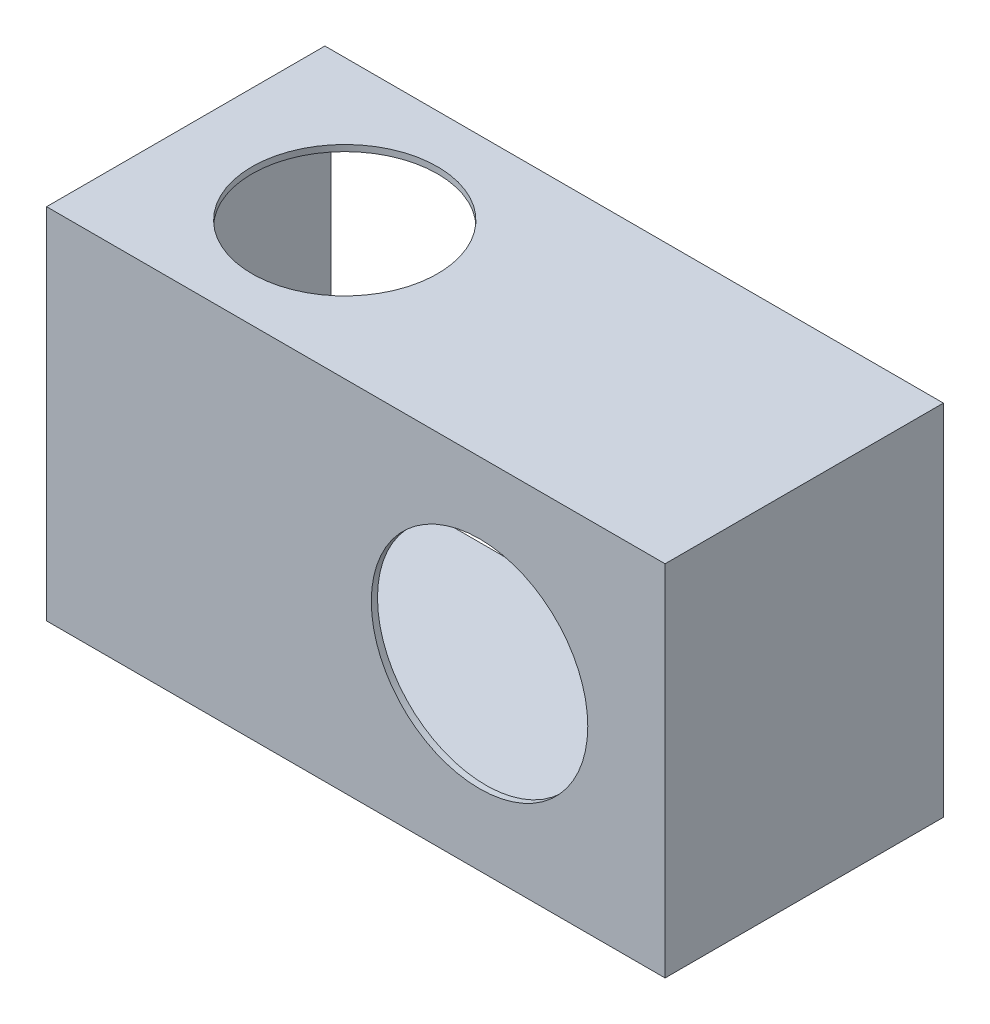
ISO-10303-21;
HEADER;
FILE_DESCRIPTION(('STEP AP214'),'2;1');
FILE_NAME('part.step','',(''),(''),'','','');
FILE_SCHEMA(('AUTOMOTIVE_DESIGN { 1 0 10303 214 1 1 1 1 }'));
ENDSEC;
DATA;
#1=APPLICATION_CONTEXT('core data for automotive mechanical design processes');
#2=APPLICATION_PROTOCOL_DEFINITION('international standard','automotive_design',2000,#1);
#3=PRODUCT_CONTEXT('',#1,'mechanical');
#4=PRODUCT('Part','Part','',(#3));
#5=PRODUCT_RELATED_PRODUCT_CATEGORY('part','',(#4));
#6=PRODUCT_DEFINITION_FORMATION('','',#4);
#7=PRODUCT_DEFINITION_CONTEXT('part definition',#1,'design');
#8=PRODUCT_DEFINITION('design','',#6,#7);
#9=PRODUCT_DEFINITION_SHAPE('','',#8);
#10=(LENGTH_UNIT() NAMED_UNIT(*) SI_UNIT(.MILLI.,.METRE.));
#11=(NAMED_UNIT(*) PLANE_ANGLE_UNIT() SI_UNIT($,.RADIAN.));
#12=(NAMED_UNIT(*) SI_UNIT($,.STERADIAN.) SOLID_ANGLE_UNIT());
#13=UNCERTAINTY_MEASURE_WITH_UNIT(LENGTH_MEASURE(1.E-05),#10,'distance_accuracy_value','');
#14=(GEOMETRIC_REPRESENTATION_CONTEXT(3) GLOBAL_UNCERTAINTY_ASSIGNED_CONTEXT((#13)) GLOBAL_UNIT_ASSIGNED_CONTEXT((#10,
#11,#12)) REPRESENTATION_CONTEXT('',''));
#15=CARTESIAN_POINT('',(0.,0.,0.));
#16=DIRECTION('',(0.,0.,1.));
#17=DIRECTION('',(1.,0.,0.));
#18=AXIS2_PLACEMENT_3D('',#15,#16,#17);
#19=CARTESIAN_POINT('',(-23.2522189572386,-234.055744289987,90.));
#20=DIRECTION('',(-1.,0.,0.));
#21=DIRECTION('',(0.,0.,1.));
#22=AXIS2_PLACEMENT_3D('',#19,#20,#21);
#23=PLANE('',#22);
#24=DIRECTION('',(0.,1.,0.));
#25=VECTOR('',#24,1.);
#26=CARTESIAN_POINT('',(-23.2522189572386,-234.055744289987,0.));
#27=LINE('',#26,#25);
#28=CARTESIAN_POINT('',(-23.2522189572386,-234.055744289987,0.));
#29=VERTEX_POINT('',#28);
#30=CARTESIAN_POINT('',(-23.2522189572386,-118.055744289987,0.));
#31=VERTEX_POINT('',#30);
#32=EDGE_CURVE('E153',#29,#31,#27,.T.);
#33=ORIENTED_EDGE('',*,*,#32,.T.);
#34=DIRECTION('',(0.,0.,-1.));
#35=VECTOR('',#34,1.);
#36=CARTESIAN_POINT('',(-23.2522189572386,-118.055744289987,90.));
#37=LINE('',#36,#35);
#38=CARTESIAN_POINT('',(-23.2522189572386,-118.055744289987,90.));
#39=VERTEX_POINT('',#38);
#40=EDGE_CURVE('E11',#39,#31,#37,.T.);
#41=ORIENTED_EDGE('',*,*,#40,.F.);
#42=DIRECTION('',(0.,1.,0.));
#43=VECTOR('',#42,1.);
#44=CARTESIAN_POINT('',(-23.2522189572386,-234.055744289987,90.));
#45=LINE('',#44,#43);
#46=CARTESIAN_POINT('',(-23.2522189572386,-234.055744289987,90.));
#47=VERTEX_POINT('',#46);
#48=EDGE_CURVE('E144',#47,#39,#45,.T.);
#49=ORIENTED_EDGE('',*,*,#48,.F.);
#50=DIRECTION('',(0.,0.,-1.));
#51=VECTOR('',#50,1.);
#52=CARTESIAN_POINT('',(-23.2522189572386,-234.055744289987,90.));
#53=LINE('',#52,#51);
#54=EDGE_CURVE('E58',#47,#29,#53,.T.);
#55=ORIENTED_EDGE('',*,*,#54,.T.);
#56=EDGE_LOOP('',(#33,#41,#49,#55));
#57=FACE_BOUND('',#56,.T.);
#58=ADVANCED_FACE('F33',(#57),#23,.F.);
#59=CARTESIAN_POINT('',(-23.2522189572386,-118.055744289987,90.));
#60=DIRECTION('',(0.,-1.,0.));
#61=DIRECTION('',(1.,0.,0.));
#62=AXIS2_PLACEMENT_3D('',#59,#60,#61);
#63=PLANE('',#62);
#64=CARTESIAN_POINT('',(-171.255446697937,-118.055744289987,45.5791895315827));
#65=DIRECTION('',(0.,1.,0.));
#66=DIRECTION('',(-1.,0.,0.));
#67=AXIS2_PLACEMENT_3D('',#64,#65,#66);
#68=CIRCLE('',#67,30.);
#69=CARTESIAN_POINT('',(-201.255446697937,-118.055744289987,45.5791895315827));
#70=VERTEX_POINT('',#69);
#71=EDGE_CURVE('E176',#70,#70,#68,.T.);
#72=ORIENTED_EDGE('',*,*,#71,.F.);
#73=EDGE_LOOP('',(#72));
#74=FACE_BOUND('',#73,.T.);
#75=DIRECTION('',(-1.,0.,0.));
#76=VECTOR('',#75,1.);
#77=CARTESIAN_POINT('',(-23.2522189572386,-118.055744289987,0.));
#78=LINE('',#77,#76);
#79=CARTESIAN_POINT('',(-223.252218957239,-118.055744289987,0.));
#80=VERTEX_POINT('',#79);
#81=EDGE_CURVE('E155',#31,#80,#78,.T.);
#82=ORIENTED_EDGE('',*,*,#81,.T.);
#83=DIRECTION('',(0.,0.,-1.));
#84=VECTOR('',#83,1.);
#85=CARTESIAN_POINT('',(-223.252218957239,-118.055744289987,90.));
#86=LINE('',#85,#84);
#87=CARTESIAN_POINT('',(-223.252218957239,-118.055744289987,90.));
#88=VERTEX_POINT('',#87);
#89=EDGE_CURVE('E41',#88,#80,#86,.T.);
#90=ORIENTED_EDGE('',*,*,#89,.F.);
#91=DIRECTION('',(-1.,0.,0.));
#92=VECTOR('',#91,1.);
#93=CARTESIAN_POINT('',(-23.2522189572386,-118.055744289987,90.));
#94=LINE('',#93,#92);
#95=EDGE_CURVE('E84',#39,#88,#94,.T.);
#96=ORIENTED_EDGE('',*,*,#95,.F.);
#97=ORIENTED_EDGE('',*,*,#40,.T.);
#98=EDGE_LOOP('',(#82,#90,#96,#97));
#99=FACE_BOUND('',#98,.T.);
#100=ADVANCED_FACE('F201',(#74,#99),#63,.F.);
#101=CARTESIAN_POINT('',(-223.252218957239,-234.055744289987,90.));
#102=DIRECTION('',(-1.,0.,0.));
#103=DIRECTION('',(0.,0.,1.));
#104=AXIS2_PLACEMENT_3D('',#101,#102,#103);
#105=PLANE('',#104);
#106=DIRECTION('',(0.,1.,0.));
#107=VECTOR('',#106,1.);
#108=CARTESIAN_POINT('',(-223.252218957239,-234.055744289987,0.));
#109=LINE('',#108,#107);
#110=CARTESIAN_POINT('',(-223.252218957239,-234.055744289987,0.));
#111=VERTEX_POINT('',#110);
#112=EDGE_CURVE('E159',#111,#80,#109,.T.);
#113=ORIENTED_EDGE('',*,*,#112,.F.);
#114=DIRECTION('',(0.,0.,-1.));
#115=VECTOR('',#114,1.);
#116=CARTESIAN_POINT('',(-223.252218957239,-234.055744289987,90.));
#117=LINE('',#116,#115);
#118=CARTESIAN_POINT('',(-223.252218957239,-234.055744289987,90.));
#119=VERTEX_POINT('',#118);
#120=EDGE_CURVE('E165',#119,#111,#117,.T.);
#121=ORIENTED_EDGE('',*,*,#120,.F.);
#122=DIRECTION('',(0.,1.,0.));
#123=VECTOR('',#122,1.);
#124=CARTESIAN_POINT('',(-223.252218957239,-234.055744289987,90.));
#125=LINE('',#124,#123);
#126=EDGE_CURVE('E148',#119,#88,#125,.T.);
#127=ORIENTED_EDGE('',*,*,#126,.T.);
#128=ORIENTED_EDGE('',*,*,#89,.T.);
#129=EDGE_LOOP('',(#113,#121,#127,#128));
#130=FACE_BOUND('',#129,.T.);
#131=ADVANCED_FACE('F205',(#130),#105,.T.);
#132=CARTESIAN_POINT('',(-23.2522189572386,-234.055744289987,90.));
#133=DIRECTION('',(0.,-1.,0.));
#134=DIRECTION('',(1.,0.,0.));
#135=AXIS2_PLACEMENT_3D('',#132,#133,#134);
#136=PLANE('',#135);
#137=DIRECTION('',(-1.,0.,0.));
#138=VECTOR('',#137,1.);
#139=CARTESIAN_POINT('',(-23.2522189572386,-234.055744289987,0.));
#140=LINE('',#139,#138);
#141=EDGE_CURVE('E146',#29,#111,#140,.T.);
#142=ORIENTED_EDGE('',*,*,#141,.F.);
#143=ORIENTED_EDGE('',*,*,#54,.F.);
#144=DIRECTION('',(-1.,0.,0.));
#145=VECTOR('',#144,1.);
#146=CARTESIAN_POINT('',(-23.2522189572386,-234.055744289987,90.));
#147=LINE('',#146,#145);
#148=EDGE_CURVE('E151',#47,#119,#147,.T.);
#149=ORIENTED_EDGE('',*,*,#148,.T.);
#150=ORIENTED_EDGE('',*,*,#120,.T.);
#151=EDGE_LOOP('',(#142,#143,#149,#150));
#152=FACE_BOUND('',#151,.T.);
#153=ADVANCED_FACE('F208',(#152),#136,.T.);
#154=CARTESIAN_POINT('',(0.,0.,90.));
#155=DIRECTION('',(0.,0.,1.));
#156=DIRECTION('',(1.,0.,0.));
#157=AXIS2_PLACEMENT_3D('',#154,#155,#156);
#158=PLANE('',#157);
#159=CARTESIAN_POINT('',(-83.2522189572386,-176.055744289987,90.));
#160=DIRECTION('',(0.,0.,1.));
#161=DIRECTION('',(1.,0.,0.));
#162=AXIS2_PLACEMENT_3D('',#159,#160,#161);
#163=CIRCLE('',#162,35.);
#164=CARTESIAN_POINT('',(-48.2522189572385,-176.055744289987,90.));
#165=VERTEX_POINT('',#164);
#166=EDGE_CURVE('E139',#165,#165,#163,.T.);
#167=ORIENTED_EDGE('',*,*,#166,.F.);
#168=EDGE_LOOP('',(#167));
#169=FACE_BOUND('',#168,.T.);
#170=ORIENTED_EDGE('',*,*,#48,.T.);
#171=ORIENTED_EDGE('',*,*,#95,.T.);
#172=ORIENTED_EDGE('',*,*,#126,.F.);
#173=ORIENTED_EDGE('',*,*,#148,.F.);
#174=EDGE_LOOP('',(#170,#171,#172,#173));
#175=FACE_BOUND('',#174,.T.);
#176=ADVANCED_FACE('F214',(#169,#175),#158,.T.);
#177=CARTESIAN_POINT('',(0.,0.,0.));
#178=DIRECTION('',(0.,0.,1.));
#179=DIRECTION('',(1.,0.,0.));
#180=AXIS2_PLACEMENT_3D('',#177,#178,#179);
#181=PLANE('',#180);
#182=DIRECTION('',(-1.,0.,0.));
#183=VECTOR('',#182,1.);
#184=CARTESIAN_POINT('',(-23.2522189572386,-232.055744289987,0.));
#185=LINE('',#184,#183);
#186=CARTESIAN_POINT('',(-25.2522189572386,-232.055744289987,0.));
#187=VERTEX_POINT('',#186);
#188=CARTESIAN_POINT('',(-221.252218957239,-232.055744289987,0.));
#189=VERTEX_POINT('',#188);
#190=EDGE_CURVE('E128',#187,#189,#185,.T.);
#191=ORIENTED_EDGE('',*,*,#190,.F.);
#192=DIRECTION('',(0.,1.,0.));
#193=VECTOR('',#192,1.);
#194=CARTESIAN_POINT('',(-25.2522189572386,-234.055744289987,0.));
#195=LINE('',#194,#193);
#196=CARTESIAN_POINT('',(-25.2522189572386,-120.055744289987,0.));
#197=VERTEX_POINT('',#196);
#198=EDGE_CURVE('E115',#187,#197,#195,.T.);
#199=ORIENTED_EDGE('',*,*,#198,.T.);
#200=DIRECTION('',(-1.,0.,0.));
#201=VECTOR('',#200,1.);
#202=CARTESIAN_POINT('',(-23.2522189572386,-120.055744289987,0.));
#203=LINE('',#202,#201);
#204=CARTESIAN_POINT('',(-221.252218957239,-120.055744289987,0.));
#205=VERTEX_POINT('',#204);
#206=EDGE_CURVE('E138',#197,#205,#203,.T.);
#207=ORIENTED_EDGE('',*,*,#206,.T.);
#208=DIRECTION('',(0.,1.,0.));
#209=VECTOR('',#208,1.);
#210=CARTESIAN_POINT('',(-221.252218957239,-234.055744289987,0.));
#211=LINE('',#210,#209);
#212=EDGE_CURVE('E49',#189,#205,#211,.T.);
#213=ORIENTED_EDGE('',*,*,#212,.F.);
#214=EDGE_LOOP('',(#191,#199,#207,#213));
#215=FACE_BOUND('',#214,.T.);
#216=ORIENTED_EDGE('',*,*,#32,.F.);
#217=ORIENTED_EDGE('',*,*,#141,.T.);
#218=ORIENTED_EDGE('',*,*,#112,.T.);
#219=ORIENTED_EDGE('',*,*,#81,.F.);
#220=EDGE_LOOP('',(#216,#217,#218,#219));
#221=FACE_BOUND('',#220,.T.);
#222=ADVANCED_FACE('F184',(#215,#221),#181,.F.);
#223=CARTESIAN_POINT('',(-25.2522189572386,-234.055744289987,90.));
#224=DIRECTION('',(-1.,0.,0.));
#225=DIRECTION('',(0.,0.,1.));
#226=AXIS2_PLACEMENT_3D('',#223,#224,#225);
#227=PLANE('',#226);
#228=ORIENTED_EDGE('',*,*,#198,.F.);
#229=DIRECTION('',(0.,0.,-1.));
#230=VECTOR('',#229,1.);
#231=CARTESIAN_POINT('',(-25.2522189572386,-232.055744289987,90.));
#232=LINE('',#231,#230);
#233=CARTESIAN_POINT('',(-25.2522189572386,-232.055744289987,88.));
#234=VERTEX_POINT('',#233);
#235=EDGE_CURVE('E108',#234,#187,#232,.T.);
#236=ORIENTED_EDGE('',*,*,#235,.F.);
#237=DIRECTION('',(0.,1.,0.));
#238=VECTOR('',#237,1.);
#239=CARTESIAN_POINT('',(-25.2522189572386,-234.055744289987,88.));
#240=LINE('',#239,#238);
#241=CARTESIAN_POINT('',(-25.2522189572386,-120.055744289987,88.));
#242=VERTEX_POINT('',#241);
#243=EDGE_CURVE('E112',#234,#242,#240,.T.);
#244=ORIENTED_EDGE('',*,*,#243,.T.);
#245=DIRECTION('',(0.,0.,-1.));
#246=VECTOR('',#245,1.);
#247=CARTESIAN_POINT('',(-25.2522189572386,-120.055744289987,90.));
#248=LINE('',#247,#246);
#249=EDGE_CURVE('E156',#242,#197,#248,.T.);
#250=ORIENTED_EDGE('',*,*,#249,.T.);
#251=EDGE_LOOP('',(#228,#236,#244,#250));
#252=FACE_BOUND('',#251,.T.);
#253=ADVANCED_FACE('F110',(#252),#227,.T.);
#254=CARTESIAN_POINT('',(-23.2522189572386,-120.055744289987,90.));
#255=DIRECTION('',(0.,-1.,0.));
#256=DIRECTION('',(1.,0.,0.));
#257=AXIS2_PLACEMENT_3D('',#254,#255,#256);
#258=PLANE('',#257);
#259=CARTESIAN_POINT('',(-171.255446697937,-120.055744289987,45.5791895315827));
#260=DIRECTION('',(0.,-1.,0.));
#261=DIRECTION('',(1.,0.,0.));
#262=AXIS2_PLACEMENT_3D('',#259,#260,#261);
#263=CIRCLE('',#262,30.);
#264=CARTESIAN_POINT('',(-141.255446697937,-120.055744289987,45.5791895315827));
#265=VERTEX_POINT('',#264);
#266=EDGE_CURVE('E36',#265,#265,#263,.T.);
#267=ORIENTED_EDGE('',*,*,#266,.F.);
#268=EDGE_LOOP('',(#267));
#269=FACE_BOUND('',#268,.T.);
#270=ORIENTED_EDGE('',*,*,#206,.F.);
#271=ORIENTED_EDGE('',*,*,#249,.F.);
#272=DIRECTION('',(-1.,0.,0.));
#273=VECTOR('',#272,1.);
#274=CARTESIAN_POINT('',(-23.2522189572386,-120.055744289987,88.));
#275=LINE('',#274,#273);
#276=CARTESIAN_POINT('',(-221.252218957239,-120.055744289987,88.));
#277=VERTEX_POINT('',#276);
#278=EDGE_CURVE('E127',#242,#277,#275,.T.);
#279=ORIENTED_EDGE('',*,*,#278,.T.);
#280=DIRECTION('',(0.,0.,-1.));
#281=VECTOR('',#280,1.);
#282=CARTESIAN_POINT('',(-221.252218957239,-120.055744289987,90.));
#283=LINE('',#282,#281);
#284=EDGE_CURVE('E179',#277,#205,#283,.T.);
#285=ORIENTED_EDGE('',*,*,#284,.T.);
#286=EDGE_LOOP('',(#270,#271,#279,#285));
#287=FACE_BOUND('',#286,.T.);
#288=ADVANCED_FACE('F187',(#269,#287),#258,.T.);
#289=CARTESIAN_POINT('',(-221.252218957239,-234.055744289987,90.));
#290=DIRECTION('',(-1.,0.,0.));
#291=DIRECTION('',(0.,0.,1.));
#292=AXIS2_PLACEMENT_3D('',#289,#290,#291);
#293=PLANE('',#292);
#294=ORIENTED_EDGE('',*,*,#212,.T.);
#295=ORIENTED_EDGE('',*,*,#284,.F.);
#296=DIRECTION('',(0.,1.,0.));
#297=VECTOR('',#296,1.);
#298=CARTESIAN_POINT('',(-221.252218957239,-234.055744289987,88.));
#299=LINE('',#298,#297);
#300=CARTESIAN_POINT('',(-221.252218957239,-232.055744289987,88.));
#301=VERTEX_POINT('',#300);
#302=EDGE_CURVE('E132',#301,#277,#299,.T.);
#303=ORIENTED_EDGE('',*,*,#302,.F.);
#304=DIRECTION('',(0.,0.,-1.));
#305=VECTOR('',#304,1.);
#306=CARTESIAN_POINT('',(-221.252218957239,-232.055744289987,90.));
#307=LINE('',#306,#305);
#308=EDGE_CURVE('E120',#301,#189,#307,.T.);
#309=ORIENTED_EDGE('',*,*,#308,.T.);
#310=EDGE_LOOP('',(#294,#295,#303,#309));
#311=FACE_BOUND('',#310,.T.);
#312=ADVANCED_FACE('F182',(#311),#293,.F.);
#313=CARTESIAN_POINT('',(-23.2522189572386,-232.055744289987,90.));
#314=DIRECTION('',(0.,-1.,0.));
#315=DIRECTION('',(1.,0.,0.));
#316=AXIS2_PLACEMENT_3D('',#313,#314,#315);
#317=PLANE('',#316);
#318=ORIENTED_EDGE('',*,*,#190,.T.);
#319=ORIENTED_EDGE('',*,*,#308,.F.);
#320=DIRECTION('',(-1.,0.,0.));
#321=VECTOR('',#320,1.);
#322=CARTESIAN_POINT('',(-23.2522189572386,-232.055744289987,88.));
#323=LINE('',#322,#321);
#324=EDGE_CURVE('E121',#234,#301,#323,.T.);
#325=ORIENTED_EDGE('',*,*,#324,.F.);
#326=ORIENTED_EDGE('',*,*,#235,.T.);
#327=EDGE_LOOP('',(#318,#319,#325,#326));
#328=FACE_BOUND('',#327,.T.);
#329=ADVANCED_FACE('F130',(#328),#317,.F.);
#330=CARTESIAN_POINT('',(0.,0.,88.));
#331=DIRECTION('',(0.,0.,1.));
#332=DIRECTION('',(1.,0.,0.));
#333=AXIS2_PLACEMENT_3D('',#330,#331,#332);
#334=PLANE('',#333);
#335=CARTESIAN_POINT('',(-83.2522189572386,-176.055744289987,88.));
#336=DIRECTION('',(0.,0.,-1.));
#337=DIRECTION('',(-1.,0.,0.));
#338=AXIS2_PLACEMENT_3D('',#335,#336,#337);
#339=CIRCLE('',#338,35.);
#340=CARTESIAN_POINT('',(-118.252218957239,-176.055744289987,88.));
#341=VERTEX_POINT('',#340);
#342=EDGE_CURVE('E168',#341,#341,#339,.T.);
#343=ORIENTED_EDGE('',*,*,#342,.F.);
#344=EDGE_LOOP('',(#343));
#345=FACE_BOUND('',#344,.T.);
#346=ORIENTED_EDGE('',*,*,#243,.F.);
#347=ORIENTED_EDGE('',*,*,#324,.T.);
#348=ORIENTED_EDGE('',*,*,#302,.T.);
#349=ORIENTED_EDGE('',*,*,#278,.F.);
#350=EDGE_LOOP('',(#346,#347,#348,#349));
#351=FACE_BOUND('',#350,.T.);
#352=ADVANCED_FACE('F125',(#345,#351),#334,.F.);
#353=CARTESIAN_POINT('',(-83.2522189572386,-176.055744289987,98.));
#354=DIRECTION('',(0.,0.,-1.));
#355=DIRECTION('',(-1.,0.,0.));
#356=AXIS2_PLACEMENT_3D('',#353,#354,#355);
#357=CYLINDRICAL_SURFACE('',#356,35.);
#358=ORIENTED_EDGE('',*,*,#166,.T.);
#359=EDGE_LOOP('',(#358));
#360=FACE_BOUND('',#359,.T.);
#361=ORIENTED_EDGE('',*,*,#342,.T.);
#362=EDGE_LOOP('',(#361));
#363=FACE_BOUND('',#362,.T.);
#364=ADVANCED_FACE('F275',(#360,#363),#357,.F.);
#365=CARTESIAN_POINT('',(-171.255446697937,-128.055744289987,45.5791895315827));
#366=DIRECTION('',(0.,1.,0.));
#367=DIRECTION('',(-1.,0.,0.));
#368=AXIS2_PLACEMENT_3D('',#365,#366,#367);
#369=CYLINDRICAL_SURFACE('',#368,30.);
#370=ORIENTED_EDGE('',*,*,#266,.T.);
#371=EDGE_LOOP('',(#370));
#372=FACE_BOUND('',#371,.T.);
#373=ORIENTED_EDGE('',*,*,#71,.T.);
#374=EDGE_LOOP('',(#373));
#375=FACE_BOUND('',#374,.T.);
#376=ADVANCED_FACE('F283',(#372,#375),#369,.F.);
#377=CLOSED_SHELL('',(#58,#100,#131,#153,#176,#222,#253,#288,#312,#329,#352,#364,#376));
#378=MANIFOLD_SOLID_BREP('B2',#377);
#379=ADVANCED_BREP_SHAPE_REPRESENTATION('',(#18,#378),#14);
#380=SHAPE_DEFINITION_REPRESENTATION(#9,#379);
ENDSEC;
END-ISO-10303-21;
